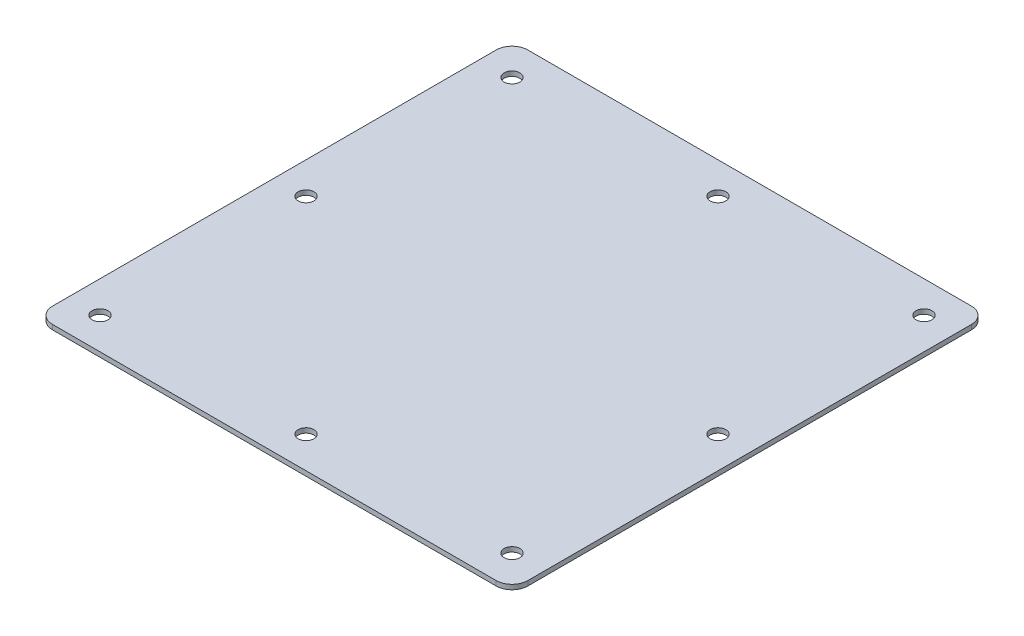
ISO-10303-21;
HEADER;
FILE_DESCRIPTION(('STEP AP214'),'2;1');
FILE_NAME('part.step','',(''),(''),'','','');
FILE_SCHEMA(('AUTOMOTIVE_DESIGN { 1 0 10303 214 1 1 1 1 }'));
ENDSEC;
DATA;
#1=APPLICATION_CONTEXT('core data for automotive mechanical design processes');
#2=APPLICATION_PROTOCOL_DEFINITION('international standard','automotive_design',2000,#1);
#3=PRODUCT_CONTEXT('',#1,'mechanical');
#4=PRODUCT('Part','Part','',(#3));
#5=PRODUCT_RELATED_PRODUCT_CATEGORY('part','',(#4));
#6=PRODUCT_DEFINITION_FORMATION('','',#4);
#7=PRODUCT_DEFINITION_CONTEXT('part definition',#1,'design');
#8=PRODUCT_DEFINITION('design','',#6,#7);
#9=PRODUCT_DEFINITION_SHAPE('','',#8);
#10=(LENGTH_UNIT() NAMED_UNIT(*) SI_UNIT(.MILLI.,.METRE.));
#11=(NAMED_UNIT(*) PLANE_ANGLE_UNIT() SI_UNIT($,.RADIAN.));
#12=(NAMED_UNIT(*) SI_UNIT($,.STERADIAN.) SOLID_ANGLE_UNIT());
#13=UNCERTAINTY_MEASURE_WITH_UNIT(LENGTH_MEASURE(1.E-05),#10,'distance_accuracy_value','');
#14=(GEOMETRIC_REPRESENTATION_CONTEXT(3) GLOBAL_UNCERTAINTY_ASSIGNED_CONTEXT((#13)) GLOBAL_UNIT_ASSIGNED_CONTEXT((#10,
#11,#12)) REPRESENTATION_CONTEXT('',''));
#15=CARTESIAN_POINT('',(0.,0.,0.));
#16=DIRECTION('',(0.,0.,1.));
#17=DIRECTION('',(1.,0.,0.));
#18=AXIS2_PLACEMENT_3D('',#15,#16,#17);
#19=CARTESIAN_POINT('',(-150.,3.,-150.));
#20=DIRECTION('',(1.,0.,0.));
#21=DIRECTION('',(0.,0.,-1.));
#22=AXIS2_PLACEMENT_3D('',#19,#20,#21);
#23=PLANE('',#22);
#24=DIRECTION('',(0.,0.,1.));
#25=VECTOR('',#24,1.);
#26=CARTESIAN_POINT('',(-150.,0.,-150.));
#27=LINE('',#26,#25);
#28=CARTESIAN_POINT('',(-150.,0.,-140.));
#29=VERTEX_POINT('',#28);
#30=CARTESIAN_POINT('',(-150.,0.,140.));
#31=VERTEX_POINT('',#30);
#32=EDGE_CURVE('E160',#29,#31,#27,.T.);
#33=ORIENTED_EDGE('',*,*,#32,.T.);
#34=DIRECTION('',(0.,-1.,0.));
#35=VECTOR('',#34,1.);
#36=CARTESIAN_POINT('',(-150.,3.,140.));
#37=LINE('',#36,#35);
#38=CARTESIAN_POINT('',(-150.,3.,140.));
#39=VERTEX_POINT('',#38);
#40=EDGE_CURVE('E11',#31,#39,#37,.F.);
#41=ORIENTED_EDGE('',*,*,#40,.T.);
#42=DIRECTION('',(0.,0.,1.));
#43=VECTOR('',#42,1.);
#44=CARTESIAN_POINT('',(-150.,3.,-150.));
#45=LINE('',#44,#43);
#46=CARTESIAN_POINT('',(-150.,3.,-140.));
#47=VERTEX_POINT('',#46);
#48=EDGE_CURVE('E128',#47,#39,#45,.T.);
#49=ORIENTED_EDGE('',*,*,#48,.F.);
#50=DIRECTION('',(0.,-1.,0.));
#51=VECTOR('',#50,1.);
#52=CARTESIAN_POINT('',(-150.,3.,-140.));
#53=LINE('',#52,#51);
#54=EDGE_CURVE('E44',#47,#29,#53,.T.);
#55=ORIENTED_EDGE('',*,*,#54,.T.);
#56=EDGE_LOOP('',(#33,#41,#49,#55));
#57=FACE_BOUND('',#56,.T.);
#58=ADVANCED_FACE('F36',(#57),#23,.F.);
#59=CARTESIAN_POINT('',(-150.,3.,150.));
#60=DIRECTION('',(0.,0.,-1.));
#61=DIRECTION('',(-1.,0.,0.));
#62=AXIS2_PLACEMENT_3D('',#59,#60,#61);
#63=PLANE('',#62);
#64=DIRECTION('',(1.,0.,0.));
#65=VECTOR('',#64,1.);
#66=CARTESIAN_POINT('',(-150.,0.,150.));
#67=LINE('',#66,#65);
#68=CARTESIAN_POINT('',(-140.,0.,150.));
#69=VERTEX_POINT('',#68);
#70=CARTESIAN_POINT('',(140.,0.,150.));
#71=VERTEX_POINT('',#70);
#72=EDGE_CURVE('E133',#69,#71,#67,.T.);
#73=ORIENTED_EDGE('',*,*,#72,.T.);
#74=DIRECTION('',(0.,-1.,0.));
#75=VECTOR('',#74,1.);
#76=CARTESIAN_POINT('',(140.,3.,150.));
#77=LINE('',#76,#75);
#78=CARTESIAN_POINT('',(140.,3.,150.));
#79=VERTEX_POINT('',#78);
#80=EDGE_CURVE('E51',#71,#79,#77,.F.);
#81=ORIENTED_EDGE('',*,*,#80,.T.);
#82=DIRECTION('',(1.,0.,0.));
#83=VECTOR('',#82,1.);
#84=CARTESIAN_POINT('',(-150.,3.,150.));
#85=LINE('',#84,#83);
#86=CARTESIAN_POINT('',(-140.,3.,150.));
#87=VERTEX_POINT('',#86);
#88=EDGE_CURVE('E131',#87,#79,#85,.T.);
#89=ORIENTED_EDGE('',*,*,#88,.F.);
#90=DIRECTION('',(0.,-1.,0.));
#91=VECTOR('',#90,1.);
#92=CARTESIAN_POINT('',(-140.,3.,150.));
#93=LINE('',#92,#91);
#94=EDGE_CURVE('E152',#87,#69,#93,.T.);
#95=ORIENTED_EDGE('',*,*,#94,.T.);
#96=EDGE_LOOP('',(#73,#81,#89,#95));
#97=FACE_BOUND('',#96,.T.);
#98=ADVANCED_FACE('F254',(#97),#63,.F.);
#99=CARTESIAN_POINT('',(150.,3.,-150.));
#100=DIRECTION('',(-1.,0.,0.));
#101=DIRECTION('',(0.,0.,1.));
#102=AXIS2_PLACEMENT_3D('',#99,#100,#101);
#103=PLANE('',#102);
#104=DIRECTION('',(0.,0.,-1.));
#105=VECTOR('',#104,1.);
#106=CARTESIAN_POINT('',(150.,0.,-150.));
#107=LINE('',#106,#105);
#108=CARTESIAN_POINT('',(150.,0.,140.));
#109=VERTEX_POINT('',#108);
#110=CARTESIAN_POINT('',(150.,0.,-140.));
#111=VERTEX_POINT('',#110);
#112=EDGE_CURVE('E129',#109,#111,#107,.T.);
#113=ORIENTED_EDGE('',*,*,#112,.T.);
#114=DIRECTION('',(0.,-1.,0.));
#115=VECTOR('',#114,1.);
#116=CARTESIAN_POINT('',(150.,3.,-140.));
#117=LINE('',#116,#115);
#118=CARTESIAN_POINT('',(150.,3.,-140.));
#119=VERTEX_POINT('',#118);
#120=EDGE_CURVE('E107',#111,#119,#117,.F.);
#121=ORIENTED_EDGE('',*,*,#120,.T.);
#122=DIRECTION('',(0.,0.,-1.));
#123=VECTOR('',#122,1.);
#124=CARTESIAN_POINT('',(150.,3.,-150.));
#125=LINE('',#124,#123);
#126=CARTESIAN_POINT('',(150.,3.,140.));
#127=VERTEX_POINT('',#126);
#128=EDGE_CURVE('E172',#127,#119,#125,.T.);
#129=ORIENTED_EDGE('',*,*,#128,.F.);
#130=DIRECTION('',(0.,-1.,0.));
#131=VECTOR('',#130,1.);
#132=CARTESIAN_POINT('',(150.,3.,140.));
#133=LINE('',#132,#131);
#134=EDGE_CURVE('E112',#127,#109,#133,.T.);
#135=ORIENTED_EDGE('',*,*,#134,.T.);
#136=EDGE_LOOP('',(#113,#121,#129,#135));
#137=FACE_BOUND('',#136,.T.);
#138=ADVANCED_FACE('F251',(#137),#103,.F.);
#139=CARTESIAN_POINT('',(-150.,3.,-150.));
#140=DIRECTION('',(0.,0.,1.));
#141=DIRECTION('',(1.,0.,0.));
#142=AXIS2_PLACEMENT_3D('',#139,#140,#141);
#143=PLANE('',#142);
#144=DIRECTION('',(-1.,0.,0.));
#145=VECTOR('',#144,1.);
#146=CARTESIAN_POINT('',(-150.,3.,-150.));
#147=LINE('',#146,#145);
#148=CARTESIAN_POINT('',(140.,3.,-150.));
#149=VERTEX_POINT('',#148);
#150=CARTESIAN_POINT('',(-140.,3.,-150.));
#151=VERTEX_POINT('',#150);
#152=EDGE_CURVE('E122',#149,#151,#147,.T.);
#153=ORIENTED_EDGE('',*,*,#152,.F.);
#154=DIRECTION('',(0.,-1.,0.));
#155=VECTOR('',#154,1.);
#156=CARTESIAN_POINT('',(140.,3.,-150.));
#157=LINE('',#156,#155);
#158=CARTESIAN_POINT('',(140.,0.,-150.));
#159=VERTEX_POINT('',#158);
#160=EDGE_CURVE('E106',#149,#159,#157,.T.);
#161=ORIENTED_EDGE('',*,*,#160,.T.);
#162=DIRECTION('',(-1.,0.,0.));
#163=VECTOR('',#162,1.);
#164=CARTESIAN_POINT('',(-150.,0.,-150.));
#165=LINE('',#164,#163);
#166=CARTESIAN_POINT('',(-140.,0.,-150.));
#167=VERTEX_POINT('',#166);
#168=EDGE_CURVE('E119',#159,#167,#165,.T.);
#169=ORIENTED_EDGE('',*,*,#168,.T.);
#170=DIRECTION('',(0.,-1.,0.));
#171=VECTOR('',#170,1.);
#172=CARTESIAN_POINT('',(-140.,3.,-150.));
#173=LINE('',#172,#171);
#174=EDGE_CURVE('E124',#167,#151,#173,.F.);
#175=ORIENTED_EDGE('',*,*,#174,.T.);
#176=EDGE_LOOP('',(#153,#161,#169,#175));
#177=FACE_BOUND('',#176,.T.);
#178=ADVANCED_FACE('F118',(#177),#143,.F.);
#179=CARTESIAN_POINT('',(0.,3.,0.));
#180=DIRECTION('',(0.,1.,0.));
#181=DIRECTION('',(0.,0.,1.));
#182=AXIS2_PLACEMENT_3D('',#179,#180,#181);
#183=PLANE('',#182);
#184=CARTESIAN_POINT('',(0.,3.,130.));
#185=DIRECTION('',(0.,1.,0.));
#186=DIRECTION('',(0.,0.,1.));
#187=AXIS2_PLACEMENT_3D('',#184,#185,#186);
#188=CIRCLE('',#187,5.);
#189=CARTESIAN_POINT('',(0.,3.,135.));
#190=VERTEX_POINT('',#189);
#191=EDGE_CURVE('E215',#190,#190,#188,.T.);
#192=ORIENTED_EDGE('',*,*,#191,.F.);
#193=EDGE_LOOP('',(#192));
#194=FACE_BOUND('',#193,.T.);
#195=CARTESIAN_POINT('',(0.,3.,-130.));
#196=DIRECTION('',(0.,1.,0.));
#197=DIRECTION('',(0.,0.,1.));
#198=AXIS2_PLACEMENT_3D('',#195,#196,#197);
#199=CIRCLE('',#198,5.);
#200=CARTESIAN_POINT('',(0.,3.,-125.));
#201=VERTEX_POINT('',#200);
#202=EDGE_CURVE('E209',#201,#201,#199,.T.);
#203=ORIENTED_EDGE('',*,*,#202,.F.);
#204=EDGE_LOOP('',(#203));
#205=FACE_BOUND('',#204,.T.);
#206=CARTESIAN_POINT('',(130.,3.,0.));
#207=DIRECTION('',(0.,-1.,0.));
#208=DIRECTION('',(0.,0.,1.));
#209=AXIS2_PLACEMENT_3D('',#206,#207,#208);
#210=CIRCLE('',#209,4.99999999999999);
#211=CARTESIAN_POINT('',(130.,3.,4.99999999999999));
#212=VERTEX_POINT('',#211);
#213=EDGE_CURVE('E203',#212,#212,#210,.T.);
#214=ORIENTED_EDGE('',*,*,#213,.T.);
#215=EDGE_LOOP('',(#214));
#216=FACE_BOUND('',#215,.T.);
#217=CARTESIAN_POINT('',(-130.,3.,0.));
#218=DIRECTION('',(0.,1.,0.));
#219=DIRECTION('',(0.,0.,1.));
#220=AXIS2_PLACEMENT_3D('',#217,#218,#219);
#221=CIRCLE('',#220,4.99999999999999);
#222=CARTESIAN_POINT('',(-130.,3.,4.99999999999999));
#223=VERTEX_POINT('',#222);
#224=EDGE_CURVE('E197',#223,#223,#221,.T.);
#225=ORIENTED_EDGE('',*,*,#224,.F.);
#226=EDGE_LOOP('',(#225));
#227=FACE_BOUND('',#226,.T.);
#228=CARTESIAN_POINT('',(130.,3.,130.));
#229=DIRECTION('',(0.,1.,0.));
#230=DIRECTION('',(0.,0.,-1.));
#231=AXIS2_PLACEMENT_3D('',#228,#229,#230);
#232=CIRCLE('',#231,4.99999999999999);
#233=CARTESIAN_POINT('',(130.,3.,125.));
#234=VERTEX_POINT('',#233);
#235=EDGE_CURVE('E191',#234,#234,#232,.T.);
#236=ORIENTED_EDGE('',*,*,#235,.F.);
#237=EDGE_LOOP('',(#236));
#238=FACE_BOUND('',#237,.T.);
#239=CARTESIAN_POINT('',(130.,3.,-130.));
#240=DIRECTION('',(0.,-1.,0.));
#241=DIRECTION('',(0.,0.,1.));
#242=AXIS2_PLACEMENT_3D('',#239,#240,#241);
#243=CIRCLE('',#242,4.99999999999999);
#244=CARTESIAN_POINT('',(130.,3.,-125.));
#245=VERTEX_POINT('',#244);
#246=EDGE_CURVE('E185',#245,#245,#243,.T.);
#247=ORIENTED_EDGE('',*,*,#246,.T.);
#248=EDGE_LOOP('',(#247));
#249=FACE_BOUND('',#248,.T.);
#250=CARTESIAN_POINT('',(-130.,3.,130.));
#251=DIRECTION('',(0.,-1.,0.));
#252=DIRECTION('',(0.,0.,-1.));
#253=AXIS2_PLACEMENT_3D('',#250,#251,#252);
#254=CIRCLE('',#253,4.99999999999999);
#255=CARTESIAN_POINT('',(-130.,3.,125.));
#256=VERTEX_POINT('',#255);
#257=EDGE_CURVE('E179',#256,#256,#254,.T.);
#258=ORIENTED_EDGE('',*,*,#257,.T.);
#259=EDGE_LOOP('',(#258));
#260=FACE_BOUND('',#259,.T.);
#261=CARTESIAN_POINT('',(-130.,3.,-130.));
#262=DIRECTION('',(0.,1.,0.));
#263=DIRECTION('',(0.,0.,1.));
#264=AXIS2_PLACEMENT_3D('',#261,#262,#263);
#265=CIRCLE('',#264,4.99999999999999);
#266=CARTESIAN_POINT('',(-130.,3.,-125.));
#267=VERTEX_POINT('',#266);
#268=EDGE_CURVE('E168',#267,#267,#265,.T.);
#269=ORIENTED_EDGE('',*,*,#268,.F.);
#270=EDGE_LOOP('',(#269));
#271=FACE_BOUND('',#270,.T.);
#272=ORIENTED_EDGE('',*,*,#128,.T.);
#273=CARTESIAN_POINT('',(140.,3.,-140.));
#274=DIRECTION('',(0.,1.,0.));
#275=DIRECTION('',(0.,0.,1.));
#276=AXIS2_PLACEMENT_3D('',#273,#274,#275);
#277=CIRCLE('',#276,10.);
#278=EDGE_CURVE('E150',#119,#149,#277,.T.);
#279=ORIENTED_EDGE('',*,*,#278,.T.);
#280=ORIENTED_EDGE('',*,*,#152,.T.);
#281=CARTESIAN_POINT('',(-140.,3.,-140.));
#282=DIRECTION('',(0.,1.,0.));
#283=DIRECTION('',(0.,0.,1.));
#284=AXIS2_PLACEMENT_3D('',#281,#282,#283);
#285=CIRCLE('',#284,10.);
#286=EDGE_CURVE('E145',#151,#47,#285,.T.);
#287=ORIENTED_EDGE('',*,*,#286,.T.);
#288=ORIENTED_EDGE('',*,*,#48,.T.);
#289=CARTESIAN_POINT('',(-140.,3.,140.));
#290=DIRECTION('',(0.,1.,0.));
#291=DIRECTION('',(0.,0.,1.));
#292=AXIS2_PLACEMENT_3D('',#289,#290,#291);
#293=CIRCLE('',#292,10.);
#294=EDGE_CURVE('E58',#39,#87,#293,.T.);
#295=ORIENTED_EDGE('',*,*,#294,.T.);
#296=ORIENTED_EDGE('',*,*,#88,.T.);
#297=CARTESIAN_POINT('',(140.,3.,140.));
#298=DIRECTION('',(0.,1.,0.));
#299=DIRECTION('',(0.,0.,1.));
#300=AXIS2_PLACEMENT_3D('',#297,#298,#299);
#301=CIRCLE('',#300,10.);
#302=EDGE_CURVE('E148',#79,#127,#301,.T.);
#303=ORIENTED_EDGE('',*,*,#302,.T.);
#304=EDGE_LOOP('',(#272,#279,#280,#287,#288,#295,#296,#303));
#305=FACE_BOUND('',#304,.T.);
#306=ADVANCED_FACE('F230',(#194,#205,#216,#227,#238,#249,#260,#271,#305),#183,.T.);
#307=CARTESIAN_POINT('',(0.,0.,0.));
#308=DIRECTION('',(0.,1.,0.));
#309=DIRECTION('',(0.,0.,1.));
#310=AXIS2_PLACEMENT_3D('',#307,#308,#309);
#311=PLANE('',#310);
#312=CARTESIAN_POINT('',(0.,0.,130.));
#313=DIRECTION('',(0.,1.,0.));
#314=DIRECTION('',(0.,0.,1.));
#315=AXIS2_PLACEMENT_3D('',#312,#313,#314);
#316=CIRCLE('',#315,5.);
#317=CARTESIAN_POINT('',(0.,0.,135.));
#318=VERTEX_POINT('',#317);
#319=EDGE_CURVE('E212',#318,#318,#316,.T.);
#320=ORIENTED_EDGE('',*,*,#319,.T.);
#321=EDGE_LOOP('',(#320));
#322=FACE_BOUND('',#321,.T.);
#323=CARTESIAN_POINT('',(0.,0.,-130.));
#324=DIRECTION('',(0.,1.,0.));
#325=DIRECTION('',(0.,0.,1.));
#326=AXIS2_PLACEMENT_3D('',#323,#324,#325);
#327=CIRCLE('',#326,5.);
#328=CARTESIAN_POINT('',(0.,0.,-125.));
#329=VERTEX_POINT('',#328);
#330=EDGE_CURVE('E206',#329,#329,#327,.T.);
#331=ORIENTED_EDGE('',*,*,#330,.T.);
#332=EDGE_LOOP('',(#331));
#333=FACE_BOUND('',#332,.T.);
#334=CARTESIAN_POINT('',(130.,0.,0.));
#335=DIRECTION('',(0.,-1.,0.));
#336=DIRECTION('',(0.,0.,1.));
#337=AXIS2_PLACEMENT_3D('',#334,#335,#336);
#338=CIRCLE('',#337,4.99999999999999);
#339=CARTESIAN_POINT('',(130.,0.,4.99999999999999));
#340=VERTEX_POINT('',#339);
#341=EDGE_CURVE('E200',#340,#340,#338,.T.);
#342=ORIENTED_EDGE('',*,*,#341,.F.);
#343=EDGE_LOOP('',(#342));
#344=FACE_BOUND('',#343,.T.);
#345=CARTESIAN_POINT('',(-130.,0.,0.));
#346=DIRECTION('',(0.,1.,0.));
#347=DIRECTION('',(0.,0.,1.));
#348=AXIS2_PLACEMENT_3D('',#345,#346,#347);
#349=CIRCLE('',#348,4.99999999999999);
#350=CARTESIAN_POINT('',(-130.,0.,4.99999999999999));
#351=VERTEX_POINT('',#350);
#352=EDGE_CURVE('E194',#351,#351,#349,.T.);
#353=ORIENTED_EDGE('',*,*,#352,.T.);
#354=EDGE_LOOP('',(#353));
#355=FACE_BOUND('',#354,.T.);
#356=CARTESIAN_POINT('',(130.,0.,130.));
#357=DIRECTION('',(0.,1.,0.));
#358=DIRECTION('',(0.,0.,-1.));
#359=AXIS2_PLACEMENT_3D('',#356,#357,#358);
#360=CIRCLE('',#359,4.99999999999999);
#361=CARTESIAN_POINT('',(130.,0.,125.));
#362=VERTEX_POINT('',#361);
#363=EDGE_CURVE('E188',#362,#362,#360,.T.);
#364=ORIENTED_EDGE('',*,*,#363,.T.);
#365=EDGE_LOOP('',(#364));
#366=FACE_BOUND('',#365,.T.);
#367=CARTESIAN_POINT('',(130.,0.,-130.));
#368=DIRECTION('',(0.,-1.,0.));
#369=DIRECTION('',(0.,0.,1.));
#370=AXIS2_PLACEMENT_3D('',#367,#368,#369);
#371=CIRCLE('',#370,4.99999999999999);
#372=CARTESIAN_POINT('',(130.,0.,-125.));
#373=VERTEX_POINT('',#372);
#374=EDGE_CURVE('E182',#373,#373,#371,.T.);
#375=ORIENTED_EDGE('',*,*,#374,.F.);
#376=EDGE_LOOP('',(#375));
#377=FACE_BOUND('',#376,.T.);
#378=CARTESIAN_POINT('',(-130.,0.,130.));
#379=DIRECTION('',(0.,-1.,0.));
#380=DIRECTION('',(0.,0.,-1.));
#381=AXIS2_PLACEMENT_3D('',#378,#379,#380);
#382=CIRCLE('',#381,4.99999999999999);
#383=CARTESIAN_POINT('',(-130.,0.,125.));
#384=VERTEX_POINT('',#383);
#385=EDGE_CURVE('E177',#384,#384,#382,.T.);
#386=ORIENTED_EDGE('',*,*,#385,.F.);
#387=EDGE_LOOP('',(#386));
#388=FACE_BOUND('',#387,.T.);
#389=CARTESIAN_POINT('',(-130.,0.,-130.));
#390=DIRECTION('',(0.,1.,0.));
#391=DIRECTION('',(0.,0.,1.));
#392=AXIS2_PLACEMENT_3D('',#389,#390,#391);
#393=CIRCLE('',#392,4.99999999999999);
#394=CARTESIAN_POINT('',(-130.,0.,-125.));
#395=VERTEX_POINT('',#394);
#396=EDGE_CURVE('E165',#395,#395,#393,.T.);
#397=ORIENTED_EDGE('',*,*,#396,.T.);
#398=EDGE_LOOP('',(#397));
#399=FACE_BOUND('',#398,.T.);
#400=ORIENTED_EDGE('',*,*,#168,.F.);
#401=CARTESIAN_POINT('',(140.,0.,-140.));
#402=DIRECTION('',(0.,1.,0.));
#403=DIRECTION('',(0.,0.,1.));
#404=AXIS2_PLACEMENT_3D('',#401,#402,#403);
#405=CIRCLE('',#404,10.);
#406=EDGE_CURVE('E102',#159,#111,#405,.F.);
#407=ORIENTED_EDGE('',*,*,#406,.T.);
#408=ORIENTED_EDGE('',*,*,#112,.F.);
#409=CARTESIAN_POINT('',(140.,0.,140.));
#410=DIRECTION('',(0.,1.,0.));
#411=DIRECTION('',(0.,0.,1.));
#412=AXIS2_PLACEMENT_3D('',#409,#410,#411);
#413=CIRCLE('',#412,10.);
#414=EDGE_CURVE('E113',#109,#71,#413,.F.);
#415=ORIENTED_EDGE('',*,*,#414,.T.);
#416=ORIENTED_EDGE('',*,*,#72,.F.);
#417=CARTESIAN_POINT('',(-140.,0.,140.));
#418=DIRECTION('',(0.,1.,0.));
#419=DIRECTION('',(0.,0.,1.));
#420=AXIS2_PLACEMENT_3D('',#417,#418,#419);
#421=CIRCLE('',#420,10.);
#422=EDGE_CURVE('E139',#69,#31,#421,.F.);
#423=ORIENTED_EDGE('',*,*,#422,.T.);
#424=ORIENTED_EDGE('',*,*,#32,.F.);
#425=CARTESIAN_POINT('',(-140.,0.,-140.));
#426=DIRECTION('',(0.,1.,0.));
#427=DIRECTION('',(0.,0.,1.));
#428=AXIS2_PLACEMENT_3D('',#425,#426,#427);
#429=CIRCLE('',#428,10.);
#430=EDGE_CURVE('E123',#29,#167,#429,.F.);
#431=ORIENTED_EDGE('',*,*,#430,.T.);
#432=EDGE_LOOP('',(#400,#407,#408,#415,#416,#423,#424,#431));
#433=FACE_BOUND('',#432,.T.);
#434=ADVANCED_FACE('F126',(#322,#333,#344,#355,#366,#377,#388,#399,#433),#311,.F.);
#435=CARTESIAN_POINT('',(140.,3.,-140.));
#436=DIRECTION('',(0.,-1.,0.));
#437=DIRECTION('',(0.,0.,-1.));
#438=AXIS2_PLACEMENT_3D('',#435,#436,#437);
#439=CYLINDRICAL_SURFACE('',#438,10.);
#440=ORIENTED_EDGE('',*,*,#278,.F.);
#441=ORIENTED_EDGE('',*,*,#120,.F.);
#442=ORIENTED_EDGE('',*,*,#406,.F.);
#443=ORIENTED_EDGE('',*,*,#160,.F.);
#444=EDGE_LOOP('',(#440,#441,#442,#443));
#445=FACE_BOUND('',#444,.T.);
#446=ADVANCED_FACE('F105',(#445),#439,.T.);
#447=CARTESIAN_POINT('',(140.,3.,140.));
#448=DIRECTION('',(0.,-1.,0.));
#449=DIRECTION('',(0.,0.,-1.));
#450=AXIS2_PLACEMENT_3D('',#447,#448,#449);
#451=CYLINDRICAL_SURFACE('',#450,10.);
#452=ORIENTED_EDGE('',*,*,#302,.F.);
#453=ORIENTED_EDGE('',*,*,#80,.F.);
#454=ORIENTED_EDGE('',*,*,#414,.F.);
#455=ORIENTED_EDGE('',*,*,#134,.F.);
#456=EDGE_LOOP('',(#452,#453,#454,#455));
#457=FACE_BOUND('',#456,.T.);
#458=ADVANCED_FACE('F253',(#457),#451,.T.);
#459=CARTESIAN_POINT('',(-140.,3.,140.));
#460=DIRECTION('',(0.,-1.,0.));
#461=DIRECTION('',(0.,0.,-1.));
#462=AXIS2_PLACEMENT_3D('',#459,#460,#461);
#463=CYLINDRICAL_SURFACE('',#462,10.);
#464=ORIENTED_EDGE('',*,*,#294,.F.);
#465=ORIENTED_EDGE('',*,*,#40,.F.);
#466=ORIENTED_EDGE('',*,*,#422,.F.);
#467=ORIENTED_EDGE('',*,*,#94,.F.);
#468=EDGE_LOOP('',(#464,#465,#466,#467));
#469=FACE_BOUND('',#468,.T.);
#470=ADVANCED_FACE('F257',(#469),#463,.T.);
#471=CARTESIAN_POINT('',(-140.,3.,-140.));
#472=DIRECTION('',(0.,-1.,0.));
#473=DIRECTION('',(0.,0.,-1.));
#474=AXIS2_PLACEMENT_3D('',#471,#472,#473);
#475=CYLINDRICAL_SURFACE('',#474,10.);
#476=ORIENTED_EDGE('',*,*,#286,.F.);
#477=ORIENTED_EDGE('',*,*,#174,.F.);
#478=ORIENTED_EDGE('',*,*,#430,.F.);
#479=ORIENTED_EDGE('',*,*,#54,.F.);
#480=EDGE_LOOP('',(#476,#477,#478,#479));
#481=FACE_BOUND('',#480,.T.);
#482=ADVANCED_FACE('F38',(#481),#475,.T.);
#483=CARTESIAN_POINT('',(-130.,0.,-130.));
#484=DIRECTION('',(0.,1.,0.));
#485=DIRECTION('',(0.,0.,1.));
#486=AXIS2_PLACEMENT_3D('',#483,#484,#485);
#487=CYLINDRICAL_SURFACE('',#486,4.99999999999999);
#488=ORIENTED_EDGE('',*,*,#396,.F.);
#489=EDGE_LOOP('',(#488));
#490=FACE_BOUND('',#489,.T.);
#491=ORIENTED_EDGE('',*,*,#268,.T.);
#492=EDGE_LOOP('',(#491));
#493=FACE_BOUND('',#492,.T.);
#494=ADVANCED_FACE('F259',(#490,#493),#487,.F.);
#495=CARTESIAN_POINT('',(-130.,0.,130.));
#496=DIRECTION('',(0.,1.,0.));
#497=DIRECTION('',(0.,0.,1.));
#498=AXIS2_PLACEMENT_3D('',#495,#496,#497);
#499=CYLINDRICAL_SURFACE('',#498,4.99999999999999);
#500=ORIENTED_EDGE('',*,*,#385,.T.);
#501=EDGE_LOOP('',(#500));
#502=FACE_BOUND('',#501,.T.);
#503=ORIENTED_EDGE('',*,*,#257,.F.);
#504=EDGE_LOOP('',(#503));
#505=FACE_BOUND('',#504,.T.);
#506=ADVANCED_FACE('F264',(#502,#505),#499,.F.);
#507=CARTESIAN_POINT('',(130.,0.,-130.));
#508=DIRECTION('',(0.,1.,0.));
#509=DIRECTION('',(0.,0.,1.));
#510=AXIS2_PLACEMENT_3D('',#507,#508,#509);
#511=CYLINDRICAL_SURFACE('',#510,4.99999999999999);
#512=ORIENTED_EDGE('',*,*,#374,.T.);
#513=EDGE_LOOP('',(#512));
#514=FACE_BOUND('',#513,.T.);
#515=ORIENTED_EDGE('',*,*,#246,.F.);
#516=EDGE_LOOP('',(#515));
#517=FACE_BOUND('',#516,.T.);
#518=ADVANCED_FACE('F306',(#514,#517),#511,.F.);
#519=CARTESIAN_POINT('',(130.,0.,130.));
#520=DIRECTION('',(0.,1.,0.));
#521=DIRECTION('',(0.,0.,1.));
#522=AXIS2_PLACEMENT_3D('',#519,#520,#521);
#523=CYLINDRICAL_SURFACE('',#522,4.99999999999999);
#524=ORIENTED_EDGE('',*,*,#363,.F.);
#525=EDGE_LOOP('',(#524));
#526=FACE_BOUND('',#525,.T.);
#527=ORIENTED_EDGE('',*,*,#235,.T.);
#528=EDGE_LOOP('',(#527));
#529=FACE_BOUND('',#528,.T.);
#530=ADVANCED_FACE('F316',(#526,#529),#523,.F.);
#531=CARTESIAN_POINT('',(-130.,0.,0.));
#532=DIRECTION('',(0.,1.,0.));
#533=DIRECTION('',(0.,0.,1.));
#534=AXIS2_PLACEMENT_3D('',#531,#532,#533);
#535=CYLINDRICAL_SURFACE('',#534,4.99999999999999);
#536=ORIENTED_EDGE('',*,*,#352,.F.);
#537=EDGE_LOOP('',(#536));
#538=FACE_BOUND('',#537,.T.);
#539=ORIENTED_EDGE('',*,*,#224,.T.);
#540=EDGE_LOOP('',(#539));
#541=FACE_BOUND('',#540,.T.);
#542=ADVANCED_FACE('F326',(#538,#541),#535,.F.);
#543=CARTESIAN_POINT('',(130.,0.,0.));
#544=DIRECTION('',(0.,1.,0.));
#545=DIRECTION('',(0.,0.,1.));
#546=AXIS2_PLACEMENT_3D('',#543,#544,#545);
#547=CYLINDRICAL_SURFACE('',#546,4.99999999999999);
#548=ORIENTED_EDGE('',*,*,#341,.T.);
#549=EDGE_LOOP('',(#548));
#550=FACE_BOUND('',#549,.T.);
#551=ORIENTED_EDGE('',*,*,#213,.F.);
#552=EDGE_LOOP('',(#551));
#553=FACE_BOUND('',#552,.T.);
#554=ADVANCED_FACE('F336',(#550,#553),#547,.F.);
#555=CARTESIAN_POINT('',(0.,0.,-130.));
#556=DIRECTION('',(0.,1.,0.));
#557=DIRECTION('',(0.,0.,1.));
#558=AXIS2_PLACEMENT_3D('',#555,#556,#557);
#559=CYLINDRICAL_SURFACE('',#558,5.);
#560=ORIENTED_EDGE('',*,*,#330,.F.);
#561=EDGE_LOOP('',(#560));
#562=FACE_BOUND('',#561,.T.);
#563=ORIENTED_EDGE('',*,*,#202,.T.);
#564=EDGE_LOOP('',(#563));
#565=FACE_BOUND('',#564,.T.);
#566=ADVANCED_FACE('F226',(#562,#565),#559,.F.);
#567=CARTESIAN_POINT('',(0.,0.,130.));
#568=DIRECTION('',(0.,1.,0.));
#569=DIRECTION('',(0.,0.,1.));
#570=AXIS2_PLACEMENT_3D('',#567,#568,#569);
#571=CYLINDRICAL_SURFACE('',#570,5.);
#572=ORIENTED_EDGE('',*,*,#319,.F.);
#573=EDGE_LOOP('',(#572));
#574=FACE_BOUND('',#573,.T.);
#575=ORIENTED_EDGE('',*,*,#191,.T.);
#576=EDGE_LOOP('',(#575));
#577=FACE_BOUND('',#576,.T.);
#578=ADVANCED_FACE('F223',(#574,#577),#571,.F.);
#579=CLOSED_SHELL('',(#58,#98,#138,#178,#306,#434,#446,#458,#470,#482,#494,#506,#518,#530,#542,
#554,#566,#578));
#580=MANIFOLD_SOLID_BREP('B2',#579);
#581=ADVANCED_BREP_SHAPE_REPRESENTATION('',(#18,#580),#14);
#582=SHAPE_DEFINITION_REPRESENTATION(#9,#581);
ENDSEC;
END-ISO-10303-21;
